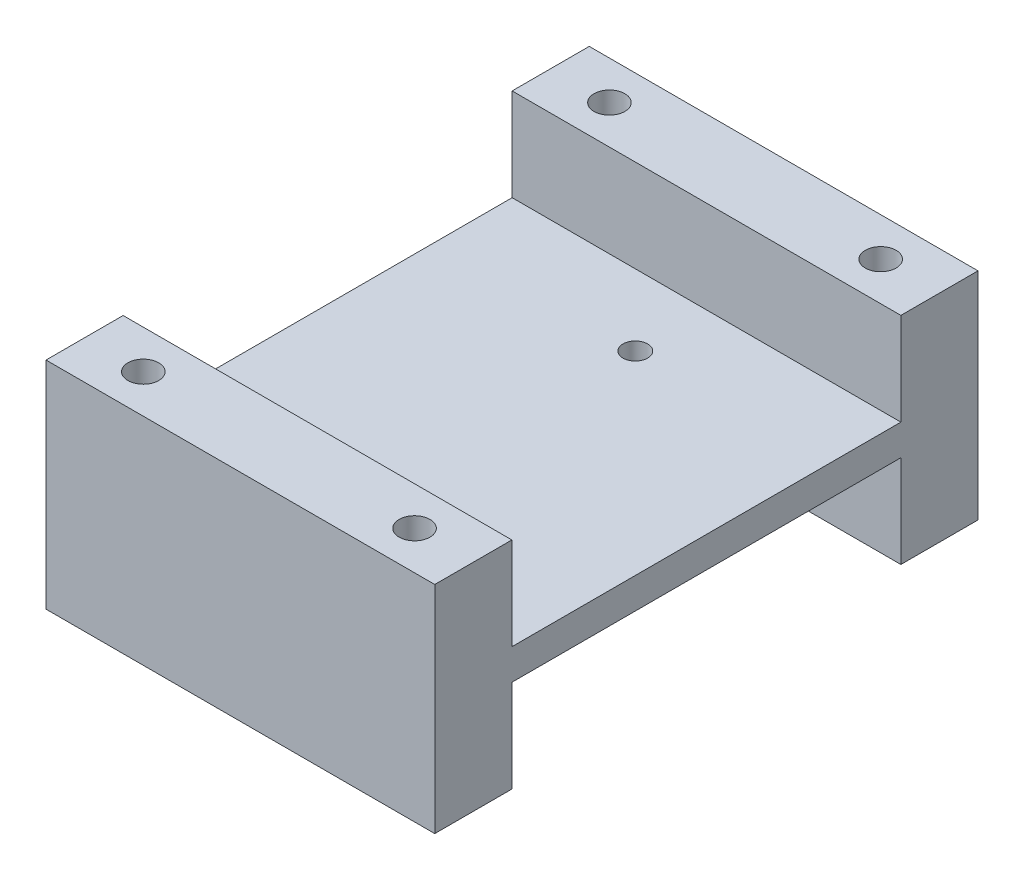
ISO-10303-21;
HEADER;
FILE_DESCRIPTION(('STEP AP214'),'2;1');
FILE_NAME('part.step','',(''),(''),'','','');
FILE_SCHEMA(('AUTOMOTIVE_DESIGN { 1 0 10303 214 1 1 1 1 }'));
ENDSEC;
DATA;
#1=APPLICATION_CONTEXT('core data for automotive mechanical design processes');
#2=APPLICATION_PROTOCOL_DEFINITION('international standard','automotive_design',2000,#1);
#3=PRODUCT_CONTEXT('',#1,'mechanical');
#4=PRODUCT('Part','Part','',(#3));
#5=PRODUCT_RELATED_PRODUCT_CATEGORY('part','',(#4));
#6=PRODUCT_DEFINITION_FORMATION('','',#4);
#7=PRODUCT_DEFINITION_CONTEXT('part definition',#1,'design');
#8=PRODUCT_DEFINITION('design','',#6,#7);
#9=PRODUCT_DEFINITION_SHAPE('','',#8);
#10=(LENGTH_UNIT() NAMED_UNIT(*) SI_UNIT(.MILLI.,.METRE.));
#11=(NAMED_UNIT(*) PLANE_ANGLE_UNIT() SI_UNIT($,.RADIAN.));
#12=(NAMED_UNIT(*) SI_UNIT($,.STERADIAN.) SOLID_ANGLE_UNIT());
#13=UNCERTAINTY_MEASURE_WITH_UNIT(LENGTH_MEASURE(1.E-05),#10,'distance_accuracy_value','');
#14=(GEOMETRIC_REPRESENTATION_CONTEXT(3) GLOBAL_UNCERTAINTY_ASSIGNED_CONTEXT((#13)) GLOBAL_UNIT_ASSIGNED_CONTEXT((#10,
#11,#12)) REPRESENTATION_CONTEXT('',''));
#15=CARTESIAN_POINT('',(0.,0.,0.));
#16=DIRECTION('',(0.,0.,1.));
#17=DIRECTION('',(1.,0.,0.));
#18=AXIS2_PLACEMENT_3D('',#15,#16,#17);
#19=CARTESIAN_POINT('',(0.,0.,72.5));
#20=DIRECTION('',(0.,-1.,0.));
#21=DIRECTION('',(0.,0.,-1.));
#22=AXIS2_PLACEMENT_3D('',#19,#20,#21);
#23=PLANE('',#22);
#24=CARTESIAN_POINT('',(-22.,0.,37.805));
#25=DIRECTION('',(0.,-1.,0.));
#26=DIRECTION('',(0.,0.,-1.));
#27=AXIS2_PLACEMENT_3D('',#24,#25,#26);
#28=CIRCLE('',#27,2.5);
#29=CARTESIAN_POINT('',(-22.,0.,35.305));
#30=VERTEX_POINT('',#29);
#31=EDGE_CURVE('E200',#30,#30,#28,.T.);
#32=ORIENTED_EDGE('',*,*,#31,.T.);
#33=EDGE_LOOP('',(#32));
#34=FACE_BOUND('',#33,.T.);
#35=CARTESIAN_POINT('',(22.,0.,37.805));
#36=DIRECTION('',(0.,-1.,0.));
#37=DIRECTION('',(0.,0.,-1.));
#38=AXIS2_PLACEMENT_3D('',#35,#36,#37);
#39=CIRCLE('',#38,2.5);
#40=CARTESIAN_POINT('',(22.,0.,35.305));
#41=VERTEX_POINT('',#40);
#42=EDGE_CURVE('E197',#41,#41,#39,.T.);
#43=ORIENTED_EDGE('',*,*,#42,.T.);
#44=EDGE_LOOP('',(#43));
#45=FACE_BOUND('',#44,.T.);
#46=DIRECTION('',(0.,0.,-1.));
#47=VECTOR('',#46,1.);
#48=CARTESIAN_POINT('',(-31.53,0.,44.06));
#49=LINE('',#48,#47);
#50=CARTESIAN_POINT('',(-31.53,0.,44.06));
#51=VERTEX_POINT('',#50);
#52=CARTESIAN_POINT('',(-31.53,0.,31.55));
#53=VERTEX_POINT('',#52);
#54=EDGE_CURVE('E184',#51,#53,#49,.T.);
#55=ORIENTED_EDGE('',*,*,#54,.F.);
#56=DIRECTION('',(-1.,0.,0.));
#57=VECTOR('',#56,1.);
#58=CARTESIAN_POINT('',(-31.53,0.,44.06));
#59=LINE('',#58,#57);
#60=CARTESIAN_POINT('',(31.53,0.,44.06));
#61=VERTEX_POINT('',#60);
#62=EDGE_CURVE('E177',#61,#51,#59,.T.);
#63=ORIENTED_EDGE('',*,*,#62,.F.);
#64=DIRECTION('',(0.,0.,1.));
#65=VECTOR('',#64,1.);
#66=CARTESIAN_POINT('',(31.53,0.,44.06));
#67=LINE('',#66,#65);
#68=CARTESIAN_POINT('',(31.53,0.,31.55));
#69=VERTEX_POINT('',#68);
#70=EDGE_CURVE('E180',#69,#61,#67,.T.);
#71=ORIENTED_EDGE('',*,*,#70,.F.);
#72=DIRECTION('',(1.,0.,0.));
#73=VECTOR('',#72,1.);
#74=CARTESIAN_POINT('',(-31.53,0.,31.55));
#75=LINE('',#74,#73);
#76=EDGE_CURVE('E182',#53,#69,#75,.T.);
#77=ORIENTED_EDGE('',*,*,#76,.F.);
#78=EDGE_LOOP('',(#55,#63,#71,#77));
#79=FACE_BOUND('',#78,.T.);
#80=ADVANCED_FACE('F40',(#34,#45,#79),#23,.F.);
#81=CARTESIAN_POINT('',(-22.,0.,-37.805));
#82=DIRECTION('',(0.,-1.,0.));
#83=DIRECTION('',(0.,0.,-1.));
#84=AXIS2_PLACEMENT_3D('',#81,#82,#83);
#85=CIRCLE('',#84,2.5);
#86=CARTESIAN_POINT('',(-22.,0.,-40.305));
#87=VERTEX_POINT('',#86);
#88=EDGE_CURVE('E202',#87,#87,#85,.T.);
#89=ORIENTED_EDGE('',*,*,#88,.T.);
#90=EDGE_LOOP('',(#89));
#91=FACE_BOUND('',#90,.T.);
#92=CARTESIAN_POINT('',(22.,0.,-37.805));
#93=DIRECTION('',(0.,-1.,0.));
#94=DIRECTION('',(0.,0.,-1.));
#95=AXIS2_PLACEMENT_3D('',#92,#93,#94);
#96=CIRCLE('',#95,2.5);
#97=CARTESIAN_POINT('',(22.,0.,-40.305));
#98=VERTEX_POINT('',#97);
#99=EDGE_CURVE('E44',#98,#98,#96,.T.);
#100=ORIENTED_EDGE('',*,*,#99,.T.);
#101=EDGE_LOOP('',(#100));
#102=FACE_BOUND('',#101,.T.);
#103=DIRECTION('',(0.,0.,1.));
#104=VECTOR('',#103,1.);
#105=CARTESIAN_POINT('',(31.53,0.,-44.06));
#106=LINE('',#105,#104);
#107=CARTESIAN_POINT('',(31.53,0.,-44.06));
#108=VERTEX_POINT('',#107);
#109=CARTESIAN_POINT('',(31.53,0.,-31.55));
#110=VERTEX_POINT('',#109);
#111=EDGE_CURVE('E154',#108,#110,#106,.T.);
#112=ORIENTED_EDGE('',*,*,#111,.F.);
#113=DIRECTION('',(1.,0.,0.));
#114=VECTOR('',#113,1.);
#115=CARTESIAN_POINT('',(-31.53,0.,-44.06));
#116=LINE('',#115,#114);
#117=CARTESIAN_POINT('',(-31.53,0.,-44.06));
#118=VERTEX_POINT('',#117);
#119=EDGE_CURVE('E194',#118,#108,#116,.T.);
#120=ORIENTED_EDGE('',*,*,#119,.F.);
#121=DIRECTION('',(0.,0.,-1.));
#122=VECTOR('',#121,1.);
#123=CARTESIAN_POINT('',(-31.53,0.,-44.06));
#124=LINE('',#123,#122);
#125=CARTESIAN_POINT('',(-31.53,0.,-31.55));
#126=VERTEX_POINT('',#125);
#127=EDGE_CURVE('E192',#126,#118,#124,.T.);
#128=ORIENTED_EDGE('',*,*,#127,.F.);
#129=DIRECTION('',(-1.,0.,0.));
#130=VECTOR('',#129,1.);
#131=CARTESIAN_POINT('',(-31.53,0.,-31.55));
#132=LINE('',#131,#130);
#133=EDGE_CURVE('E190',#110,#126,#132,.T.);
#134=ORIENTED_EDGE('',*,*,#133,.F.);
#135=EDGE_LOOP('',(#112,#120,#128,#134));
#136=FACE_BOUND('',#135,.T.);
#137=ADVANCED_FACE('F209',(#91,#102,#136),#23,.F.);
#138=CARTESIAN_POINT('',(-3.90346666831155E-13,-9.99999999999999,-20.0000000000001));
#139=DIRECTION('',(0.,-1.,0.));
#140=DIRECTION('',(0.,0.,-1.));
#141=AXIS2_PLACEMENT_3D('',#138,#139,#140);
#142=CYLINDRICAL_SURFACE('',#141,2.00000000000007);
#143=CARTESIAN_POINT('',(-3.92115275043505E-13,-20.,-20.0000000000001));
#144=DIRECTION('',(0.,1.,0.));
#145=DIRECTION('',(0.,0.,1.));
#146=AXIS2_PLACEMENT_3D('',#143,#144,#145);
#147=CIRCLE('',#146,2.00000000000007);
#148=CARTESIAN_POINT('',(-3.92115275043505E-13,-20.,-18.));
#149=VERTEX_POINT('',#148);
#150=EDGE_CURVE('E11',#149,#149,#147,.T.);
#151=ORIENTED_EDGE('',*,*,#150,.F.);
#152=EDGE_LOOP('',(#151));
#153=FACE_BOUND('',#152,.T.);
#154=CARTESIAN_POINT('',(-3.9123097093733E-13,-15.,-20.0000000000001));
#155=DIRECTION('',(0.,-1.,0.));
#156=DIRECTION('',(0.,0.,-1.));
#157=AXIS2_PLACEMENT_3D('',#154,#155,#156);
#158=CIRCLE('',#157,2.00000000000007);
#159=CARTESIAN_POINT('',(-3.9123097093733E-13,-15.,-22.0000000000002));
#160=VERTEX_POINT('',#159);
#161=EDGE_CURVE('E172',#160,#160,#158,.F.);
#162=ORIENTED_EDGE('',*,*,#161,.T.);
#163=EDGE_LOOP('',(#162));
#164=FACE_BOUND('',#163,.T.);
#165=ADVANCED_FACE('F322',(#153,#164),#142,.F.);
#166=CARTESIAN_POINT('',(3.31298299175197E-13,-9.99999999999998,20.));
#167=DIRECTION('',(0.,-1.,0.));
#168=DIRECTION('',(0.,0.,-1.));
#169=AXIS2_PLACEMENT_3D('',#166,#167,#168);
#170=CYLINDRICAL_SURFACE('',#169,2.00000000000007);
#171=CARTESIAN_POINT('',(3.29529690962847E-13,-20.,20.));
#172=DIRECTION('',(0.,1.,0.));
#173=DIRECTION('',(0.,0.,1.));
#174=AXIS2_PLACEMENT_3D('',#171,#172,#173);
#175=CIRCLE('',#174,2.00000000000007);
#176=CARTESIAN_POINT('',(3.29529690962847E-13,-20.,22.0000000000001));
#177=VERTEX_POINT('',#176);
#178=EDGE_CURVE('E49',#177,#177,#175,.T.);
#179=ORIENTED_EDGE('',*,*,#178,.F.);
#180=EDGE_LOOP('',(#179));
#181=FACE_BOUND('',#180,.T.);
#182=CARTESIAN_POINT('',(3.30413995069022E-13,-15.,20.));
#183=DIRECTION('',(0.,-1.,0.));
#184=DIRECTION('',(0.,0.,-1.));
#185=AXIS2_PLACEMENT_3D('',#182,#183,#184);
#186=CIRCLE('',#185,2.00000000000007);
#187=CARTESIAN_POINT('',(3.30413995069022E-13,-15.,17.9999999999999));
#188=VERTEX_POINT('',#187);
#189=EDGE_CURVE('E169',#188,#188,#186,.F.);
#190=ORIENTED_EDGE('',*,*,#189,.T.);
#191=EDGE_LOOP('',(#190));
#192=FACE_BOUND('',#191,.T.);
#193=ADVANCED_FACE('F326',(#181,#192),#170,.F.);
#194=CARTESIAN_POINT('',(-31.53,-35.,-31.55));
#195=DIRECTION('',(0.,0.,-1.));
#196=DIRECTION('',(-1.,0.,0.));
#197=AXIS2_PLACEMENT_3D('',#194,#195,#196);
#198=PLANE('',#197);
#199=DIRECTION('',(-1.,0.,0.));
#200=VECTOR('',#199,1.);
#201=CARTESIAN_POINT('',(-31.53,-15.,-31.55));
#202=LINE('',#201,#200);
#203=CARTESIAN_POINT('',(31.53,-15.,-31.55));
#204=VERTEX_POINT('',#203);
#205=CARTESIAN_POINT('',(-31.5300000000003,-15.,-31.55));
#206=VERTEX_POINT('',#205);
#207=EDGE_CURVE('E134',#204,#206,#202,.T.);
#208=ORIENTED_EDGE('',*,*,#207,.F.);
#209=DIRECTION('',(0.,1.,0.));
#210=VECTOR('',#209,1.);
#211=CARTESIAN_POINT('',(31.53,-35.,-31.55));
#212=LINE('',#211,#210);
#213=EDGE_CURVE('E137',#204,#110,#212,.T.);
#214=ORIENTED_EDGE('',*,*,#213,.T.);
#215=ORIENTED_EDGE('',*,*,#133,.T.);
#216=DIRECTION('',(0.,1.,0.));
#217=VECTOR('',#216,1.);
#218=CARTESIAN_POINT('',(-31.53,-35.,-31.55));
#219=LINE('',#218,#217);
#220=EDGE_CURVE('E139',#206,#126,#219,.T.);
#221=ORIENTED_EDGE('',*,*,#220,.F.);
#222=EDGE_LOOP('',(#208,#214,#215,#221));
#223=FACE_BOUND('',#222,.T.);
#224=ADVANCED_FACE('F136',(#223),#198,.F.);
#225=CARTESIAN_POINT('',(31.5299999999997,-15.,-43.45));
#226=DIRECTION('',(0.,-1.,0.));
#227=DIRECTION('',(0.,0.,-1.));
#228=AXIS2_PLACEMENT_3D('',#225,#226,#227);
#229=PLANE('',#228);
#230=ORIENTED_EDGE('',*,*,#189,.F.);
#231=EDGE_LOOP('',(#230));
#232=FACE_BOUND('',#231,.T.);
#233=ORIENTED_EDGE('',*,*,#161,.F.);
#234=EDGE_LOOP('',(#233));
#235=FACE_BOUND('',#234,.T.);
#236=DIRECTION('',(0.,0.,1.));
#237=VECTOR('',#236,1.);
#238=CARTESIAN_POINT('',(31.5299999999997,-15.,-43.45));
#239=LINE('',#238,#237);
#240=CARTESIAN_POINT('',(31.53,-15.,31.55));
#241=VERTEX_POINT('',#240);
#242=EDGE_CURVE('E150',#204,#241,#239,.T.);
#243=ORIENTED_EDGE('',*,*,#242,.F.);
#244=ORIENTED_EDGE('',*,*,#207,.T.);
#245=DIRECTION('',(0.,0.,1.));
#246=VECTOR('',#245,1.);
#247=CARTESIAN_POINT('',(-31.5300000000003,-15.,-43.45));
#248=LINE('',#247,#246);
#249=CARTESIAN_POINT('',(-31.5300000000003,-15.,31.55));
#250=VERTEX_POINT('',#249);
#251=EDGE_CURVE('E161',#206,#250,#248,.T.);
#252=ORIENTED_EDGE('',*,*,#251,.T.);
#253=DIRECTION('',(1.,0.,0.));
#254=VECTOR('',#253,1.);
#255=CARTESIAN_POINT('',(31.5299999999997,-15.,31.55));
#256=LINE('',#255,#254);
#257=EDGE_CURVE('E160',#250,#241,#256,.T.);
#258=ORIENTED_EDGE('',*,*,#257,.T.);
#259=EDGE_LOOP('',(#243,#244,#252,#258));
#260=FACE_BOUND('',#259,.T.);
#261=ADVANCED_FACE('F158',(#232,#235,#260),#229,.F.);
#262=CARTESIAN_POINT('',(-31.53,-35.,31.55));
#263=DIRECTION('',(0.,0.,1.));
#264=DIRECTION('',(1.,0.,0.));
#265=AXIS2_PLACEMENT_3D('',#262,#263,#264);
#266=PLANE('',#265);
#267=ORIENTED_EDGE('',*,*,#257,.F.);
#268=DIRECTION('',(0.,1.,0.));
#269=VECTOR('',#268,1.);
#270=CARTESIAN_POINT('',(-31.53,-35.,31.55));
#271=LINE('',#270,#269);
#272=EDGE_CURVE('E254',#250,#53,#271,.T.);
#273=ORIENTED_EDGE('',*,*,#272,.T.);
#274=ORIENTED_EDGE('',*,*,#76,.T.);
#275=DIRECTION('',(0.,1.,0.));
#276=VECTOR('',#275,1.);
#277=CARTESIAN_POINT('',(31.53,-35.,31.55));
#278=LINE('',#277,#276);
#279=EDGE_CURVE('E250',#241,#69,#278,.T.);
#280=ORIENTED_EDGE('',*,*,#279,.F.);
#281=EDGE_LOOP('',(#267,#273,#274,#280));
#282=FACE_BOUND('',#281,.T.);
#283=ADVANCED_FACE('F259',(#282),#266,.F.);
#284=DIRECTION('',(-1.,0.,0.));
#285=VECTOR('',#284,1.);
#286=CARTESIAN_POINT('',(31.5299999999997,-20.,31.55));
#287=LINE('',#286,#285);
#288=CARTESIAN_POINT('',(31.5299999999997,-20.,31.55));
#289=VERTEX_POINT('',#288);
#290=CARTESIAN_POINT('',(-31.5300000000003,-20.,31.55));
#291=VERTEX_POINT('',#290);
#292=EDGE_CURVE('E163',#289,#291,#287,.T.);
#293=ORIENTED_EDGE('',*,*,#292,.F.);
#294=CARTESIAN_POINT('',(31.53,-35.,31.55));
#295=VERTEX_POINT('',#294);
#296=EDGE_CURVE('E247',#295,#289,#278,.T.);
#297=ORIENTED_EDGE('',*,*,#296,.F.);
#298=DIRECTION('',(1.,0.,0.));
#299=VECTOR('',#298,1.);
#300=CARTESIAN_POINT('',(-31.53,-35.,31.55));
#301=LINE('',#300,#299);
#302=CARTESIAN_POINT('',(-31.53,-35.,31.55));
#303=VERTEX_POINT('',#302);
#304=EDGE_CURVE('E235',#303,#295,#301,.T.);
#305=ORIENTED_EDGE('',*,*,#304,.F.);
#306=EDGE_CURVE('E251',#303,#291,#271,.T.);
#307=ORIENTED_EDGE('',*,*,#306,.T.);
#308=EDGE_LOOP('',(#293,#297,#305,#307));
#309=FACE_BOUND('',#308,.T.);
#310=ADVANCED_FACE('F277',(#309),#266,.F.);
#311=CARTESIAN_POINT('',(31.5299999999997,-20.,-43.45));
#312=DIRECTION('',(0.,1.,0.));
#313=DIRECTION('',(0.,0.,1.));
#314=AXIS2_PLACEMENT_3D('',#311,#312,#313);
#315=PLANE('',#314);
#316=ORIENTED_EDGE('',*,*,#178,.T.);
#317=EDGE_LOOP('',(#316));
#318=FACE_BOUND('',#317,.T.);
#319=ORIENTED_EDGE('',*,*,#150,.T.);
#320=EDGE_LOOP('',(#319));
#321=FACE_BOUND('',#320,.T.);
#322=DIRECTION('',(0.,0.,1.));
#323=VECTOR('',#322,1.);
#324=CARTESIAN_POINT('',(-31.5300000000003,-20.,-43.45));
#325=LINE('',#324,#323);
#326=CARTESIAN_POINT('',(-31.53,-20.,-31.55));
#327=VERTEX_POINT('',#326);
#328=EDGE_CURVE('E65',#327,#291,#325,.T.);
#329=ORIENTED_EDGE('',*,*,#328,.F.);
#330=DIRECTION('',(1.,0.,0.));
#331=VECTOR('',#330,1.);
#332=CARTESIAN_POINT('',(-31.53,-20.,-31.55));
#333=LINE('',#332,#331);
#334=CARTESIAN_POINT('',(31.53,-20.,-31.55));
#335=VERTEX_POINT('',#334);
#336=EDGE_CURVE('E143',#327,#335,#333,.T.);
#337=ORIENTED_EDGE('',*,*,#336,.T.);
#338=DIRECTION('',(0.,0.,1.));
#339=VECTOR('',#338,1.);
#340=CARTESIAN_POINT('',(31.5299999999997,-20.,-43.45));
#341=LINE('',#340,#339);
#342=EDGE_CURVE('E57',#335,#289,#341,.T.);
#343=ORIENTED_EDGE('',*,*,#342,.T.);
#344=ORIENTED_EDGE('',*,*,#292,.T.);
#345=EDGE_LOOP('',(#329,#337,#343,#344));
#346=FACE_BOUND('',#345,.T.);
#347=ADVANCED_FACE('F303',(#318,#321,#346),#315,.F.);
#348=ORIENTED_EDGE('',*,*,#336,.F.);
#349=CARTESIAN_POINT('',(-31.53,-35.,-31.55));
#350=VERTEX_POINT('',#349);
#351=EDGE_CURVE('E155',#350,#327,#219,.T.);
#352=ORIENTED_EDGE('',*,*,#351,.F.);
#353=DIRECTION('',(-1.,0.,0.));
#354=VECTOR('',#353,1.);
#355=CARTESIAN_POINT('',(-31.53,-35.,-31.55));
#356=LINE('',#355,#354);
#357=CARTESIAN_POINT('',(31.53,-35.,-31.55));
#358=VERTEX_POINT('',#357);
#359=EDGE_CURVE('E292',#358,#350,#356,.T.);
#360=ORIENTED_EDGE('',*,*,#359,.F.);
#361=EDGE_CURVE('E156',#358,#335,#212,.T.);
#362=ORIENTED_EDGE('',*,*,#361,.T.);
#363=EDGE_LOOP('',(#348,#352,#360,#362));
#364=FACE_BOUND('',#363,.T.);
#365=ADVANCED_FACE('F305',(#364),#198,.F.);
#366=CARTESIAN_POINT('',(0.,-35.,0.));
#367=DIRECTION('',(0.,1.,0.));
#368=DIRECTION('',(0.,0.,1.));
#369=AXIS2_PLACEMENT_3D('',#366,#367,#368);
#370=PLANE('',#369);
#371=DIRECTION('',(0.,0.,1.));
#372=VECTOR('',#371,1.);
#373=CARTESIAN_POINT('',(31.53,-35.,-44.06));
#374=LINE('',#373,#372);
#375=CARTESIAN_POINT('',(31.53,-35.,-44.06));
#376=VERTEX_POINT('',#375);
#377=EDGE_CURVE('E196',#376,#358,#374,.T.);
#378=ORIENTED_EDGE('',*,*,#377,.T.);
#379=ORIENTED_EDGE('',*,*,#359,.T.);
#380=DIRECTION('',(0.,0.,-1.));
#381=VECTOR('',#380,1.);
#382=CARTESIAN_POINT('',(-31.53,-35.,-44.06));
#383=LINE('',#382,#381);
#384=CARTESIAN_POINT('',(-31.53,-35.,-44.06));
#385=VERTEX_POINT('',#384);
#386=EDGE_CURVE('E291',#350,#385,#383,.T.);
#387=ORIENTED_EDGE('',*,*,#386,.T.);
#388=DIRECTION('',(1.,0.,0.));
#389=VECTOR('',#388,1.);
#390=CARTESIAN_POINT('',(-31.53,-35.,-44.06));
#391=LINE('',#390,#389);
#392=EDGE_CURVE('E289',#385,#376,#391,.T.);
#393=ORIENTED_EDGE('',*,*,#392,.T.);
#394=EDGE_LOOP('',(#378,#379,#387,#393));
#395=FACE_BOUND('',#394,.T.);
#396=CARTESIAN_POINT('',(22.,-35.,-37.805));
#397=DIRECTION('',(0.,-1.,0.));
#398=DIRECTION('',(0.,0.,-1.));
#399=AXIS2_PLACEMENT_3D('',#396,#397,#398);
#400=CIRCLE('',#399,2.5);
#401=CARTESIAN_POINT('',(22.,-35.,-40.305));
#402=VERTEX_POINT('',#401);
#403=EDGE_CURVE('E189',#402,#402,#400,.T.);
#404=ORIENTED_EDGE('',*,*,#403,.F.);
#405=EDGE_LOOP('',(#404));
#406=FACE_BOUND('',#405,.T.);
#407=CARTESIAN_POINT('',(-22.,-35.,-37.805));
#408=DIRECTION('',(0.,-1.,0.));
#409=DIRECTION('',(0.,0.,1.));
#410=AXIS2_PLACEMENT_3D('',#407,#408,#409);
#411=CIRCLE('',#410,2.5);
#412=CARTESIAN_POINT('',(-22.,-35.,-35.305));
#413=VERTEX_POINT('',#412);
#414=EDGE_CURVE('E221',#413,#413,#411,.T.);
#415=ORIENTED_EDGE('',*,*,#414,.F.);
#416=EDGE_LOOP('',(#415));
#417=FACE_BOUND('',#416,.T.);
#418=ADVANCED_FACE('F216',(#395,#406,#417),#370,.F.);
#419=CARTESIAN_POINT('',(22.,-35.,-37.805));
#420=DIRECTION('',(0.,1.,0.));
#421=DIRECTION('',(0.,0.,1.));
#422=AXIS2_PLACEMENT_3D('',#419,#420,#421);
#423=CYLINDRICAL_SURFACE('',#422,2.5);
#424=ORIENTED_EDGE('',*,*,#99,.F.);
#425=EDGE_LOOP('',(#424));
#426=FACE_BOUND('',#425,.T.);
#427=ORIENTED_EDGE('',*,*,#403,.T.);
#428=EDGE_LOOP('',(#427));
#429=FACE_BOUND('',#428,.T.);
#430=ADVANCED_FACE('F212',(#426,#429),#423,.F.);
#431=CARTESIAN_POINT('',(-22.,-35.,-37.805));
#432=DIRECTION('',(0.,1.,0.));
#433=DIRECTION('',(0.,0.,1.));
#434=AXIS2_PLACEMENT_3D('',#431,#432,#433);
#435=CYLINDRICAL_SURFACE('',#434,2.5);
#436=ORIENTED_EDGE('',*,*,#88,.F.);
#437=EDGE_LOOP('',(#436));
#438=FACE_BOUND('',#437,.T.);
#439=ORIENTED_EDGE('',*,*,#414,.T.);
#440=EDGE_LOOP('',(#439));
#441=FACE_BOUND('',#440,.T.);
#442=ADVANCED_FACE('F215',(#438,#441),#435,.F.);
#443=CARTESIAN_POINT('',(31.53,-35.,-44.06));
#444=DIRECTION('',(-1.,0.,0.));
#445=DIRECTION('',(0.,0.,1.));
#446=AXIS2_PLACEMENT_3D('',#443,#444,#445);
#447=PLANE('',#446);
#448=ORIENTED_EDGE('',*,*,#213,.F.);
#449=ORIENTED_EDGE('',*,*,#242,.T.);
#450=ORIENTED_EDGE('',*,*,#279,.T.);
#451=ORIENTED_EDGE('',*,*,#70,.T.);
#452=DIRECTION('',(0.,1.,0.));
#453=VECTOR('',#452,1.);
#454=CARTESIAN_POINT('',(31.53,-35.,44.06));
#455=LINE('',#454,#453);
#456=CARTESIAN_POINT('',(31.53,-35.,44.06));
#457=VERTEX_POINT('',#456);
#458=EDGE_CURVE('E244',#457,#61,#455,.T.);
#459=ORIENTED_EDGE('',*,*,#458,.F.);
#460=DIRECTION('',(0.,0.,1.));
#461=VECTOR('',#460,1.);
#462=CARTESIAN_POINT('',(31.53,-35.,44.06));
#463=LINE('',#462,#461);
#464=EDGE_CURVE('E237',#295,#457,#463,.T.);
#465=ORIENTED_EDGE('',*,*,#464,.F.);
#466=ORIENTED_EDGE('',*,*,#296,.T.);
#467=ORIENTED_EDGE('',*,*,#342,.F.);
#468=ORIENTED_EDGE('',*,*,#361,.F.);
#469=ORIENTED_EDGE('',*,*,#377,.F.);
#470=DIRECTION('',(0.,1.,0.));
#471=VECTOR('',#470,1.);
#472=CARTESIAN_POINT('',(31.53,-35.,-44.06));
#473=LINE('',#472,#471);
#474=EDGE_CURVE('E287',#376,#108,#473,.T.);
#475=ORIENTED_EDGE('',*,*,#474,.T.);
#476=ORIENTED_EDGE('',*,*,#111,.T.);
#477=EDGE_LOOP('',(#448,#449,#450,#451,#459,#465,#466,#467,#468,#469,#475,#476));
#478=FACE_BOUND('',#477,.T.);
#479=ADVANCED_FACE('F148',(#478),#447,.F.);
#480=CARTESIAN_POINT('',(0.,-35.,0.));
#481=DIRECTION('',(0.,-1.,0.));
#482=DIRECTION('',(0.,0.,-1.));
#483=AXIS2_PLACEMENT_3D('',#480,#481,#482);
#484=PLANE('',#483);
#485=CARTESIAN_POINT('',(22.,-35.,37.805));
#486=DIRECTION('',(0.,-1.,0.));
#487=DIRECTION('',(0.,0.,1.));
#488=AXIS2_PLACEMENT_3D('',#485,#486,#487);
#489=CIRCLE('',#488,2.5);
#490=CARTESIAN_POINT('',(22.,-35.,40.305));
#491=VERTEX_POINT('',#490);
#492=EDGE_CURVE('E187',#491,#491,#489,.T.);
#493=ORIENTED_EDGE('',*,*,#492,.F.);
#494=EDGE_LOOP('',(#493));
#495=FACE_BOUND('',#494,.T.);
#496=DIRECTION('',(0.,0.,-1.));
#497=VECTOR('',#496,1.);
#498=CARTESIAN_POINT('',(-31.53,-35.,44.06));
#499=LINE('',#498,#497);
#500=CARTESIAN_POINT('',(-31.53,-35.,44.06));
#501=VERTEX_POINT('',#500);
#502=EDGE_CURVE('E179',#501,#303,#499,.T.);
#503=ORIENTED_EDGE('',*,*,#502,.T.);
#504=ORIENTED_EDGE('',*,*,#304,.T.);
#505=ORIENTED_EDGE('',*,*,#464,.T.);
#506=DIRECTION('',(-1.,0.,0.));
#507=VECTOR('',#506,1.);
#508=CARTESIAN_POINT('',(-31.53,-35.,44.06));
#509=LINE('',#508,#507);
#510=EDGE_CURVE('E239',#457,#501,#509,.T.);
#511=ORIENTED_EDGE('',*,*,#510,.T.);
#512=EDGE_LOOP('',(#503,#504,#505,#511));
#513=FACE_BOUND('',#512,.T.);
#514=CARTESIAN_POINT('',(-22.,-35.,37.805));
#515=DIRECTION('',(0.,-1.,0.));
#516=DIRECTION('',(0.,0.,-1.));
#517=AXIS2_PLACEMENT_3D('',#514,#515,#516);
#518=CIRCLE('',#517,2.5);
#519=CARTESIAN_POINT('',(-22.,-35.,35.305));
#520=VERTEX_POINT('',#519);
#521=EDGE_CURVE('E224',#520,#520,#518,.T.);
#522=ORIENTED_EDGE('',*,*,#521,.F.);
#523=EDGE_LOOP('',(#522));
#524=FACE_BOUND('',#523,.T.);
#525=ADVANCED_FACE('F273',(#495,#513,#524),#484,.T.);
#526=CARTESIAN_POINT('',(-22.,-35.,37.805));
#527=DIRECTION('',(0.,1.,0.));
#528=DIRECTION('',(0.,0.,1.));
#529=AXIS2_PLACEMENT_3D('',#526,#527,#528);
#530=CYLINDRICAL_SURFACE('',#529,2.5);
#531=ORIENTED_EDGE('',*,*,#31,.F.);
#532=EDGE_LOOP('',(#531));
#533=FACE_BOUND('',#532,.T.);
#534=ORIENTED_EDGE('',*,*,#521,.T.);
#535=EDGE_LOOP('',(#534));
#536=FACE_BOUND('',#535,.T.);
#537=ADVANCED_FACE('F328',(#533,#536),#530,.F.);
#538=CARTESIAN_POINT('',(22.,-35.,37.805));
#539=DIRECTION('',(0.,1.,0.));
#540=DIRECTION('',(0.,0.,1.));
#541=AXIS2_PLACEMENT_3D('',#538,#539,#540);
#542=CYLINDRICAL_SURFACE('',#541,2.5);
#543=ORIENTED_EDGE('',*,*,#42,.F.);
#544=EDGE_LOOP('',(#543));
#545=FACE_BOUND('',#544,.T.);
#546=ORIENTED_EDGE('',*,*,#492,.T.);
#547=EDGE_LOOP('',(#546));
#548=FACE_BOUND('',#547,.T.);
#549=ADVANCED_FACE('F42',(#545,#548),#542,.F.);
#550=CARTESIAN_POINT('',(-31.53,-35.,-44.06));
#551=DIRECTION('',(1.,0.,0.));
#552=DIRECTION('',(0.,0.,-1.));
#553=AXIS2_PLACEMENT_3D('',#550,#551,#552);
#554=PLANE('',#553);
#555=ORIENTED_EDGE('',*,*,#351,.T.);
#556=ORIENTED_EDGE('',*,*,#328,.T.);
#557=ORIENTED_EDGE('',*,*,#306,.F.);
#558=ORIENTED_EDGE('',*,*,#502,.F.);
#559=DIRECTION('',(0.,1.,0.));
#560=VECTOR('',#559,1.);
#561=CARTESIAN_POINT('',(-31.53,-35.,44.06));
#562=LINE('',#561,#560);
#563=EDGE_CURVE('E241',#501,#51,#562,.T.);
#564=ORIENTED_EDGE('',*,*,#563,.T.);
#565=ORIENTED_EDGE('',*,*,#54,.T.);
#566=ORIENTED_EDGE('',*,*,#272,.F.);
#567=ORIENTED_EDGE('',*,*,#251,.F.);
#568=ORIENTED_EDGE('',*,*,#220,.T.);
#569=ORIENTED_EDGE('',*,*,#127,.T.);
#570=DIRECTION('',(0.,1.,0.));
#571=VECTOR('',#570,1.);
#572=CARTESIAN_POINT('',(-31.53,-35.,-44.06));
#573=LINE('',#572,#571);
#574=EDGE_CURVE('E284',#385,#118,#573,.T.);
#575=ORIENTED_EDGE('',*,*,#574,.F.);
#576=ORIENTED_EDGE('',*,*,#386,.F.);
#577=EDGE_LOOP('',(#555,#556,#557,#558,#564,#565,#566,#567,#568,#569,#575,#576));
#578=FACE_BOUND('',#577,.T.);
#579=ADVANCED_FACE('F261',(#578),#554,.F.);
#580=CARTESIAN_POINT('',(-31.53,-35.,44.06));
#581=DIRECTION('',(0.,0.,-1.));
#582=DIRECTION('',(-1.,0.,0.));
#583=AXIS2_PLACEMENT_3D('',#580,#581,#582);
#584=PLANE('',#583);
#585=ORIENTED_EDGE('',*,*,#62,.T.);
#586=ORIENTED_EDGE('',*,*,#563,.F.);
#587=ORIENTED_EDGE('',*,*,#510,.F.);
#588=ORIENTED_EDGE('',*,*,#458,.T.);
#589=EDGE_LOOP('',(#585,#586,#587,#588));
#590=FACE_BOUND('',#589,.T.);
#591=ADVANCED_FACE('F271',(#590),#584,.F.);
#592=CARTESIAN_POINT('',(-31.53,-35.,-44.06));
#593=DIRECTION('',(0.,0.,1.));
#594=DIRECTION('',(1.,0.,0.));
#595=AXIS2_PLACEMENT_3D('',#592,#593,#594);
#596=PLANE('',#595);
#597=ORIENTED_EDGE('',*,*,#119,.T.);
#598=ORIENTED_EDGE('',*,*,#474,.F.);
#599=ORIENTED_EDGE('',*,*,#392,.F.);
#600=ORIENTED_EDGE('',*,*,#574,.T.);
#601=EDGE_LOOP('',(#597,#598,#599,#600));
#602=FACE_BOUND('',#601,.T.);
#603=ADVANCED_FACE('F300',(#602),#596,.F.);
#604=CLOSED_SHELL('',(#80,#137,#165,#193,#224,#261,#283,#310,#347,#365,#418,#430,#442,#479,#525,
#537,#549,#579,#591,#603));
#605=MANIFOLD_SOLID_BREP('B2',#604);
#606=ADVANCED_BREP_SHAPE_REPRESENTATION('',(#18,#605),#14);
#607=SHAPE_DEFINITION_REPRESENTATION(#9,#606);
ENDSEC;
END-ISO-10303-21;
